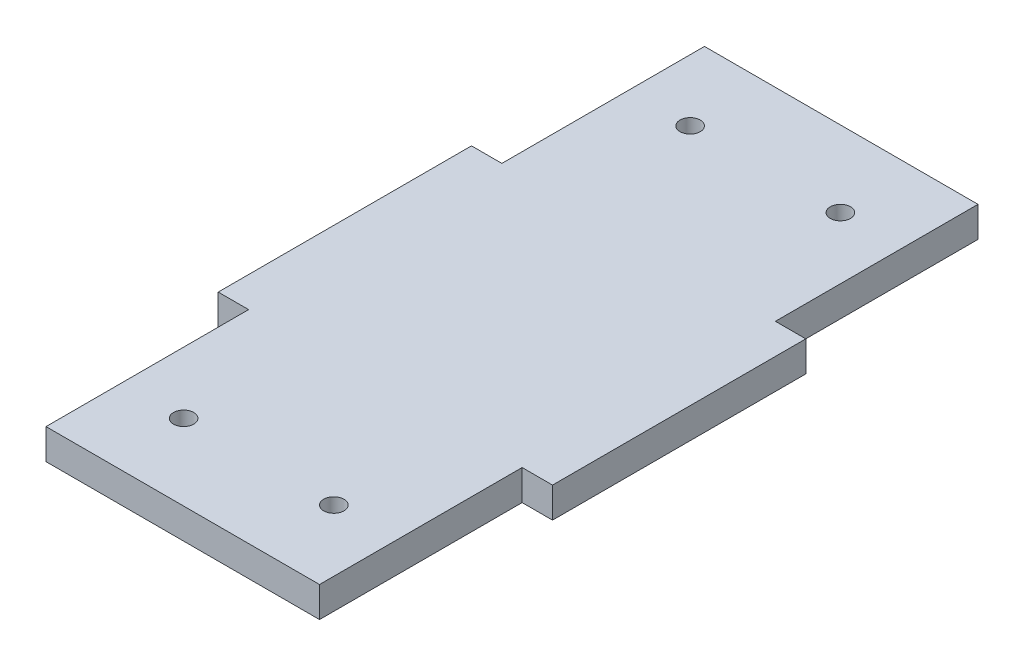
ISO-10303-21;
HEADER;
FILE_DESCRIPTION(('STEP AP214'),'2;1');
FILE_NAME('part.step','',(''),(''),'','','');
FILE_SCHEMA(('AUTOMOTIVE_DESIGN { 1 0 10303 214 1 1 1 1 }'));
ENDSEC;
DATA;
#1=APPLICATION_CONTEXT('core data for automotive mechanical design processes');
#2=APPLICATION_PROTOCOL_DEFINITION('international standard','automotive_design',2000,#1);
#3=PRODUCT_CONTEXT('',#1,'mechanical');
#4=PRODUCT('Part','Part','',(#3));
#5=PRODUCT_RELATED_PRODUCT_CATEGORY('part','',(#4));
#6=PRODUCT_DEFINITION_FORMATION('','',#4);
#7=PRODUCT_DEFINITION_CONTEXT('part definition',#1,'design');
#8=PRODUCT_DEFINITION('design','',#6,#7);
#9=PRODUCT_DEFINITION_SHAPE('','',#8);
#10=(LENGTH_UNIT() NAMED_UNIT(*) SI_UNIT(.MILLI.,.METRE.));
#11=(NAMED_UNIT(*) PLANE_ANGLE_UNIT() SI_UNIT($,.RADIAN.));
#12=(NAMED_UNIT(*) SI_UNIT($,.STERADIAN.) SOLID_ANGLE_UNIT());
#13=UNCERTAINTY_MEASURE_WITH_UNIT(LENGTH_MEASURE(1.E-05),#10,'distance_accuracy_value','');
#14=(GEOMETRIC_REPRESENTATION_CONTEXT(3) GLOBAL_UNCERTAINTY_ASSIGNED_CONTEXT((#13)) GLOBAL_UNIT_ASSIGNED_CONTEXT((#10,
#11,#12)) REPRESENTATION_CONTEXT('',''));
#15=CARTESIAN_POINT('',(0.,0.,0.));
#16=DIRECTION('',(0.,0.,1.));
#17=DIRECTION('',(1.,0.,0.));
#18=AXIS2_PLACEMENT_3D('',#15,#16,#17);
#19=CARTESIAN_POINT('',(0.,6.,31.206779661017));
#20=DIRECTION('',(0.,0.,-1.));
#21=DIRECTION('',(-1.,0.,0.));
#22=AXIS2_PLACEMENT_3D('',#19,#20,#21);
#23=PLANE('',#22);
#24=DIRECTION('',(1.,0.,0.));
#25=VECTOR('',#24,1.);
#26=CARTESIAN_POINT('',(0.,0.,31.206779661017));
#27=LINE('',#26,#25);
#28=CARTESIAN_POINT('',(-55.628420187569,0.,31.206779661017));
#29=VERTEX_POINT('',#28);
#30=CARTESIAN_POINT('',(-49.628420187569,0.,31.206779661017));
#31=VERTEX_POINT('',#30);
#32=EDGE_CURVE('E154',#29,#31,#27,.T.);
#33=ORIENTED_EDGE('',*,*,#32,.T.);
#34=DIRECTION('',(0.,-1.,0.));
#35=VECTOR('',#34,1.);
#36=CARTESIAN_POINT('',(-49.628420187569,6.,31.206779661017));
#37=LINE('',#36,#35);
#38=CARTESIAN_POINT('',(-49.628420187569,6.,31.206779661017));
#39=VERTEX_POINT('',#38);
#40=EDGE_CURVE('E11',#39,#31,#37,.T.);
#41=ORIENTED_EDGE('',*,*,#40,.F.);
#42=DIRECTION('',(1.,0.,0.));
#43=VECTOR('',#42,1.);
#44=CARTESIAN_POINT('',(0.,6.,31.206779661017));
#45=LINE('',#44,#43);
#46=CARTESIAN_POINT('',(-55.628420187569,6.,31.206779661017));
#47=VERTEX_POINT('',#46);
#48=EDGE_CURVE('E185',#47,#39,#45,.T.);
#49=ORIENTED_EDGE('',*,*,#48,.F.);
#50=DIRECTION('',(0.,-1.,0.));
#51=VECTOR('',#50,1.);
#52=CARTESIAN_POINT('',(-55.628420187569,6.,31.206779661017));
#53=LINE('',#52,#51);
#54=EDGE_CURVE('E150',#47,#29,#53,.T.);
#55=ORIENTED_EDGE('',*,*,#54,.T.);
#56=EDGE_LOOP('',(#33,#41,#49,#55));
#57=FACE_BOUND('',#56,.T.);
#58=ADVANCED_FACE('F35',(#57),#23,.F.);
#59=CARTESIAN_POINT('',(-49.628420187569,6.,0.));
#60=DIRECTION('',(1.,0.,0.));
#61=DIRECTION('',(0.,0.,-1.));
#62=AXIS2_PLACEMENT_3D('',#59,#60,#61);
#63=PLANE('',#62);
#64=DIRECTION('',(0.,0.,1.));
#65=VECTOR('',#64,1.);
#66=CARTESIAN_POINT('',(-49.628420187569,0.,0.));
#67=LINE('',#66,#65);
#68=CARTESIAN_POINT('',(-49.628420187569,0.,71.206779661017));
#69=VERTEX_POINT('',#68);
#70=EDGE_CURVE('E157',#31,#69,#67,.T.);
#71=ORIENTED_EDGE('',*,*,#70,.T.);
#72=DIRECTION('',(0.,-1.,0.));
#73=VECTOR('',#72,1.);
#74=CARTESIAN_POINT('',(-49.628420187569,6.,71.206779661017));
#75=LINE('',#74,#73);
#76=CARTESIAN_POINT('',(-49.628420187569,6.,71.206779661017));
#77=VERTEX_POINT('',#76);
#78=EDGE_CURVE('E43',#77,#69,#75,.T.);
#79=ORIENTED_EDGE('',*,*,#78,.F.);
#80=DIRECTION('',(0.,0.,1.));
#81=VECTOR('',#80,1.);
#82=CARTESIAN_POINT('',(-49.628420187569,6.,0.));
#83=LINE('',#82,#81);
#84=EDGE_CURVE('E102',#39,#77,#83,.T.);
#85=ORIENTED_EDGE('',*,*,#84,.F.);
#86=ORIENTED_EDGE('',*,*,#40,.T.);
#87=EDGE_LOOP('',(#71,#79,#85,#86));
#88=FACE_BOUND('',#87,.T.);
#89=ADVANCED_FACE('F251',(#88),#63,.F.);
#90=CARTESIAN_POINT('',(0.,6.,71.206779661017));
#91=DIRECTION('',(0.,0.,-1.));
#92=DIRECTION('',(-1.,0.,0.));
#93=AXIS2_PLACEMENT_3D('',#90,#91,#92);
#94=PLANE('',#93);
#95=DIRECTION('',(1.,0.,0.));
#96=VECTOR('',#95,1.);
#97=CARTESIAN_POINT('',(0.,0.,71.206779661017));
#98=LINE('',#97,#96);
#99=CARTESIAN_POINT('',(4.37157981243105,0.,71.206779661017));
#100=VERTEX_POINT('',#99);
#101=EDGE_CURVE('E160',#69,#100,#98,.T.);
#102=ORIENTED_EDGE('',*,*,#101,.T.);
#103=DIRECTION('',(0.,-1.,0.));
#104=VECTOR('',#103,1.);
#105=CARTESIAN_POINT('',(4.37157981243105,6.,71.206779661017));
#106=LINE('',#105,#104);
#107=CARTESIAN_POINT('',(4.37157981243105,6.,71.206779661017));
#108=VERTEX_POINT('',#107);
#109=EDGE_CURVE('E199',#108,#100,#106,.T.);
#110=ORIENTED_EDGE('',*,*,#109,.F.);
#111=DIRECTION('',(1.,0.,0.));
#112=VECTOR('',#111,1.);
#113=CARTESIAN_POINT('',(0.,6.,71.206779661017));
#114=LINE('',#113,#112);
#115=EDGE_CURVE('E206',#77,#108,#114,.T.);
#116=ORIENTED_EDGE('',*,*,#115,.F.);
#117=ORIENTED_EDGE('',*,*,#78,.T.);
#118=EDGE_LOOP('',(#102,#110,#116,#117));
#119=FACE_BOUND('',#118,.T.);
#120=ADVANCED_FACE('F204',(#119),#94,.F.);
#121=CARTESIAN_POINT('',(4.37157981243104,6.,0.));
#122=DIRECTION('',(1.,0.,0.));
#123=DIRECTION('',(0.,0.,-1.));
#124=AXIS2_PLACEMENT_3D('',#121,#122,#123);
#125=PLANE('',#124);
#126=DIRECTION('',(0.,0.,1.));
#127=VECTOR('',#126,1.);
#128=CARTESIAN_POINT('',(4.37157981243104,0.,0.));
#129=LINE('',#128,#127);
#130=CARTESIAN_POINT('',(4.37157981243105,0.,31.206779661017));
#131=VERTEX_POINT('',#130);
#132=EDGE_CURVE('E163',#131,#100,#129,.T.);
#133=ORIENTED_EDGE('',*,*,#132,.F.);
#134=DIRECTION('',(0.,-1.,0.));
#135=VECTOR('',#134,1.);
#136=CARTESIAN_POINT('',(4.37157981243105,6.,31.206779661017));
#137=LINE('',#136,#135);
#138=CARTESIAN_POINT('',(4.37157981243105,6.,31.206779661017));
#139=VERTEX_POINT('',#138);
#140=EDGE_CURVE('E197',#139,#131,#137,.T.);
#141=ORIENTED_EDGE('',*,*,#140,.F.);
#142=DIRECTION('',(0.,0.,1.));
#143=VECTOR('',#142,1.);
#144=CARTESIAN_POINT('',(4.37157981243104,6.,0.));
#145=LINE('',#144,#143);
#146=EDGE_CURVE('E217',#139,#108,#145,.T.);
#147=ORIENTED_EDGE('',*,*,#146,.T.);
#148=ORIENTED_EDGE('',*,*,#109,.T.);
#149=EDGE_LOOP('',(#133,#141,#147,#148));
#150=FACE_BOUND('',#149,.T.);
#151=ADVANCED_FACE('F213',(#150),#125,.T.);
#152=CARTESIAN_POINT('',(0.,6.,31.206779661017));
#153=DIRECTION('',(0.,0.,-1.));
#154=DIRECTION('',(-1.,0.,0.));
#155=AXIS2_PLACEMENT_3D('',#152,#153,#154);
#156=PLANE('',#155);
#157=DIRECTION('',(1.,0.,0.));
#158=VECTOR('',#157,1.);
#159=CARTESIAN_POINT('',(0.,0.,31.206779661017));
#160=LINE('',#159,#158);
#161=CARTESIAN_POINT('',(10.371579812431,0.,31.206779661017));
#162=VERTEX_POINT('',#161);
#163=EDGE_CURVE('E166',#131,#162,#160,.T.);
#164=ORIENTED_EDGE('',*,*,#163,.T.);
#165=DIRECTION('',(0.,-1.,0.));
#166=VECTOR('',#165,1.);
#167=CARTESIAN_POINT('',(10.371579812431,6.,31.206779661017));
#168=LINE('',#167,#166);
#169=CARTESIAN_POINT('',(10.371579812431,6.,31.206779661017));
#170=VERTEX_POINT('',#169);
#171=EDGE_CURVE('E195',#170,#162,#168,.T.);
#172=ORIENTED_EDGE('',*,*,#171,.F.);
#173=DIRECTION('',(1.,0.,0.));
#174=VECTOR('',#173,1.);
#175=CARTESIAN_POINT('',(0.,6.,31.206779661017));
#176=LINE('',#175,#174);
#177=EDGE_CURVE('E218',#139,#170,#176,.T.);
#178=ORIENTED_EDGE('',*,*,#177,.F.);
#179=ORIENTED_EDGE('',*,*,#140,.T.);
#180=EDGE_LOOP('',(#164,#172,#178,#179));
#181=FACE_BOUND('',#180,.T.);
#182=ADVANCED_FACE('F262',(#181),#156,.F.);
#183=CARTESIAN_POINT('',(10.371579812431,6.,0.));
#184=DIRECTION('',(1.,0.,0.));
#185=DIRECTION('',(0.,0.,-1.));
#186=AXIS2_PLACEMENT_3D('',#183,#184,#185);
#187=PLANE('',#186);
#188=DIRECTION('',(0.,0.,1.));
#189=VECTOR('',#188,1.);
#190=CARTESIAN_POINT('',(10.371579812431,0.,0.));
#191=LINE('',#190,#189);
#192=CARTESIAN_POINT('',(10.371579812431,0.,-18.793220338983));
#193=VERTEX_POINT('',#192);
#194=EDGE_CURVE('E169',#193,#162,#191,.T.);
#195=ORIENTED_EDGE('',*,*,#194,.F.);
#196=DIRECTION('',(0.,-1.,0.));
#197=VECTOR('',#196,1.);
#198=CARTESIAN_POINT('',(10.371579812431,6.,-18.793220338983));
#199=LINE('',#198,#197);
#200=CARTESIAN_POINT('',(10.371579812431,6.,-18.793220338983));
#201=VERTEX_POINT('',#200);
#202=EDGE_CURVE('E193',#201,#193,#199,.T.);
#203=ORIENTED_EDGE('',*,*,#202,.F.);
#204=DIRECTION('',(0.,0.,1.));
#205=VECTOR('',#204,1.);
#206=CARTESIAN_POINT('',(10.371579812431,6.,0.));
#207=LINE('',#206,#205);
#208=EDGE_CURVE('E220',#201,#170,#207,.T.);
#209=ORIENTED_EDGE('',*,*,#208,.T.);
#210=ORIENTED_EDGE('',*,*,#171,.T.);
#211=EDGE_LOOP('',(#195,#203,#209,#210));
#212=FACE_BOUND('',#211,.T.);
#213=ADVANCED_FACE('F265',(#212),#187,.T.);
#214=CARTESIAN_POINT('',(0.,6.,-18.793220338983));
#215=DIRECTION('',(0.,0.,-1.));
#216=DIRECTION('',(-1.,0.,0.));
#217=AXIS2_PLACEMENT_3D('',#214,#215,#216);
#218=PLANE('',#217);
#219=DIRECTION('',(1.,0.,0.));
#220=VECTOR('',#219,1.);
#221=CARTESIAN_POINT('',(0.,0.,-18.793220338983));
#222=LINE('',#221,#220);
#223=CARTESIAN_POINT('',(4.37157981243104,0.,-18.793220338983));
#224=VERTEX_POINT('',#223);
#225=EDGE_CURVE('E172',#224,#193,#222,.T.);
#226=ORIENTED_EDGE('',*,*,#225,.F.);
#227=DIRECTION('',(0.,-1.,0.));
#228=VECTOR('',#227,1.);
#229=CARTESIAN_POINT('',(4.37157981243104,6.,-18.793220338983));
#230=LINE('',#229,#228);
#231=CARTESIAN_POINT('',(4.37157981243104,6.,-18.793220338983));
#232=VERTEX_POINT('',#231);
#233=EDGE_CURVE('E191',#232,#224,#230,.T.);
#234=ORIENTED_EDGE('',*,*,#233,.F.);
#235=DIRECTION('',(1.,0.,0.));
#236=VECTOR('',#235,1.);
#237=CARTESIAN_POINT('',(0.,6.,-18.793220338983));
#238=LINE('',#237,#236);
#239=EDGE_CURVE('E227',#232,#201,#238,.T.);
#240=ORIENTED_EDGE('',*,*,#239,.T.);
#241=ORIENTED_EDGE('',*,*,#202,.T.);
#242=EDGE_LOOP('',(#226,#234,#240,#241));
#243=FACE_BOUND('',#242,.T.);
#244=ADVANCED_FACE('F269',(#243),#218,.T.);
#245=CARTESIAN_POINT('',(4.37157981243103,6.,0.));
#246=DIRECTION('',(1.,0.,0.));
#247=DIRECTION('',(0.,0.,-1.));
#248=AXIS2_PLACEMENT_3D('',#245,#246,#247);
#249=PLANE('',#248);
#250=DIRECTION('',(0.,0.,1.));
#251=VECTOR('',#250,1.);
#252=CARTESIAN_POINT('',(4.37157981243103,0.,0.));
#253=LINE('',#252,#251);
#254=CARTESIAN_POINT('',(4.37157981243105,0.,-58.793220338983));
#255=VERTEX_POINT('',#254);
#256=EDGE_CURVE('E175',#255,#224,#253,.T.);
#257=ORIENTED_EDGE('',*,*,#256,.F.);
#258=DIRECTION('',(0.,-1.,0.));
#259=VECTOR('',#258,1.);
#260=CARTESIAN_POINT('',(4.37157981243105,6.,-58.793220338983));
#261=LINE('',#260,#259);
#262=CARTESIAN_POINT('',(4.37157981243105,6.,-58.793220338983));
#263=VERTEX_POINT('',#262);
#264=EDGE_CURVE('E189',#263,#255,#261,.T.);
#265=ORIENTED_EDGE('',*,*,#264,.F.);
#266=DIRECTION('',(0.,0.,1.));
#267=VECTOR('',#266,1.);
#268=CARTESIAN_POINT('',(4.37157981243103,6.,0.));
#269=LINE('',#268,#267);
#270=EDGE_CURVE('E230',#263,#232,#269,.T.);
#271=ORIENTED_EDGE('',*,*,#270,.T.);
#272=ORIENTED_EDGE('',*,*,#233,.T.);
#273=EDGE_LOOP('',(#257,#265,#271,#272));
#274=FACE_BOUND('',#273,.T.);
#275=ADVANCED_FACE('F273',(#274),#249,.T.);
#276=CARTESIAN_POINT('',(0.,6.,-58.793220338983));
#277=DIRECTION('',(0.,0.,-1.));
#278=DIRECTION('',(-1.,0.,0.));
#279=AXIS2_PLACEMENT_3D('',#276,#277,#278);
#280=PLANE('',#279);
#281=DIRECTION('',(1.,0.,0.));
#282=VECTOR('',#281,1.);
#283=CARTESIAN_POINT('',(0.,0.,-58.793220338983));
#284=LINE('',#283,#282);
#285=CARTESIAN_POINT('',(-49.628420187569,0.,-58.793220338983));
#286=VERTEX_POINT('',#285);
#287=EDGE_CURVE('E178',#286,#255,#284,.T.);
#288=ORIENTED_EDGE('',*,*,#287,.F.);
#289=DIRECTION('',(0.,-1.,0.));
#290=VECTOR('',#289,1.);
#291=CARTESIAN_POINT('',(-49.628420187569,6.,-58.793220338983));
#292=LINE('',#291,#290);
#293=CARTESIAN_POINT('',(-49.628420187569,6.,-58.793220338983));
#294=VERTEX_POINT('',#293);
#295=EDGE_CURVE('E146',#294,#286,#292,.T.);
#296=ORIENTED_EDGE('',*,*,#295,.F.);
#297=DIRECTION('',(1.,0.,0.));
#298=VECTOR('',#297,1.);
#299=CARTESIAN_POINT('',(0.,6.,-58.793220338983));
#300=LINE('',#299,#298);
#301=EDGE_CURVE('E135',#294,#263,#300,.T.);
#302=ORIENTED_EDGE('',*,*,#301,.T.);
#303=ORIENTED_EDGE('',*,*,#264,.T.);
#304=EDGE_LOOP('',(#288,#296,#302,#303));
#305=FACE_BOUND('',#304,.T.);
#306=ADVANCED_FACE('F234',(#305),#280,.T.);
#307=CARTESIAN_POINT('',(-49.628420187569,6.,0.));
#308=DIRECTION('',(1.,0.,0.));
#309=DIRECTION('',(0.,0.,-1.));
#310=AXIS2_PLACEMENT_3D('',#307,#308,#309);
#311=PLANE('',#310);
#312=DIRECTION('',(0.,0.,1.));
#313=VECTOR('',#312,1.);
#314=CARTESIAN_POINT('',(-49.628420187569,0.,0.));
#315=LINE('',#314,#313);
#316=CARTESIAN_POINT('',(-49.628420187569,0.,-18.793220338983));
#317=VERTEX_POINT('',#316);
#318=EDGE_CURVE('E142',#286,#317,#315,.T.);
#319=ORIENTED_EDGE('',*,*,#318,.T.);
#320=DIRECTION('',(0.,-1.,0.));
#321=VECTOR('',#320,1.);
#322=CARTESIAN_POINT('',(-49.628420187569,6.,-18.793220338983));
#323=LINE('',#322,#321);
#324=CARTESIAN_POINT('',(-49.628420187569,6.,-18.793220338983));
#325=VERTEX_POINT('',#324);
#326=EDGE_CURVE('E139',#325,#317,#323,.T.);
#327=ORIENTED_EDGE('',*,*,#326,.F.);
#328=DIRECTION('',(0.,0.,1.));
#329=VECTOR('',#328,1.);
#330=CARTESIAN_POINT('',(-49.628420187569,6.,0.));
#331=LINE('',#330,#329);
#332=EDGE_CURVE('E128',#294,#325,#331,.T.);
#333=ORIENTED_EDGE('',*,*,#332,.F.);
#334=ORIENTED_EDGE('',*,*,#295,.T.);
#335=EDGE_LOOP('',(#319,#327,#333,#334));
#336=FACE_BOUND('',#335,.T.);
#337=ADVANCED_FACE('F140',(#336),#311,.F.);
#338=CARTESIAN_POINT('',(0.,6.,-18.793220338983));
#339=DIRECTION('',(0.,0.,-1.));
#340=DIRECTION('',(-1.,0.,0.));
#341=AXIS2_PLACEMENT_3D('',#338,#339,#340);
#342=PLANE('',#341);
#343=DIRECTION('',(1.,0.,0.));
#344=VECTOR('',#343,1.);
#345=CARTESIAN_POINT('',(0.,0.,-18.793220338983));
#346=LINE('',#345,#344);
#347=CARTESIAN_POINT('',(-55.628420187569,0.,-18.793220338983));
#348=VERTEX_POINT('',#347);
#349=EDGE_CURVE('E182',#348,#317,#346,.T.);
#350=ORIENTED_EDGE('',*,*,#349,.F.);
#351=DIRECTION('',(0.,-1.,0.));
#352=VECTOR('',#351,1.);
#353=CARTESIAN_POINT('',(-55.628420187569,6.,-18.793220338983));
#354=LINE('',#353,#352);
#355=CARTESIAN_POINT('',(-55.628420187569,6.,-18.793220338983));
#356=VERTEX_POINT('',#355);
#357=EDGE_CURVE('E91',#356,#348,#354,.T.);
#358=ORIENTED_EDGE('',*,*,#357,.F.);
#359=DIRECTION('',(1.,0.,0.));
#360=VECTOR('',#359,1.);
#361=CARTESIAN_POINT('',(0.,6.,-18.793220338983));
#362=LINE('',#361,#360);
#363=EDGE_CURVE('E132',#356,#325,#362,.T.);
#364=ORIENTED_EDGE('',*,*,#363,.T.);
#365=ORIENTED_EDGE('',*,*,#326,.T.);
#366=EDGE_LOOP('',(#350,#358,#364,#365));
#367=FACE_BOUND('',#366,.T.);
#368=ADVANCED_FACE('F148',(#367),#342,.T.);
#369=CARTESIAN_POINT('',(-55.628420187569,6.,0.));
#370=DIRECTION('',(1.,0.,0.));
#371=DIRECTION('',(0.,0.,-1.));
#372=AXIS2_PLACEMENT_3D('',#369,#370,#371);
#373=PLANE('',#372);
#374=DIRECTION('',(0.,0.,1.));
#375=VECTOR('',#374,1.);
#376=CARTESIAN_POINT('',(-55.628420187569,0.,0.));
#377=LINE('',#376,#375);
#378=EDGE_CURVE('E94',#348,#29,#377,.T.);
#379=ORIENTED_EDGE('',*,*,#378,.T.);
#380=ORIENTED_EDGE('',*,*,#54,.F.);
#381=DIRECTION('',(0.,0.,1.));
#382=VECTOR('',#381,1.);
#383=CARTESIAN_POINT('',(-55.628420187569,6.,0.));
#384=LINE('',#383,#382);
#385=EDGE_CURVE('E51',#356,#47,#384,.T.);
#386=ORIENTED_EDGE('',*,*,#385,.F.);
#387=ORIENTED_EDGE('',*,*,#357,.T.);
#388=EDGE_LOOP('',(#379,#380,#386,#387));
#389=FACE_BOUND('',#388,.T.);
#390=ADVANCED_FACE('F239',(#389),#373,.F.);
#391=CARTESIAN_POINT('',(0.,6.,0.));
#392=DIRECTION('',(0.,1.,0.));
#393=DIRECTION('',(0.,0.,1.));
#394=AXIS2_PLACEMENT_3D('',#391,#392,#393);
#395=PLANE('',#394);
#396=CARTESIAN_POINT('',(-37.458420187569,6.,56.206779661017));
#397=DIRECTION('',(0.,1.,0.));
#398=DIRECTION('',(0.,0.,1.));
#399=AXIS2_PLACEMENT_3D('',#396,#397,#398);
#400=CIRCLE('',#399,2.);
#401=CARTESIAN_POINT('',(-37.458420187569,6.,58.206779661017));
#402=VERTEX_POINT('',#401);
#403=EDGE_CURVE('E357',#402,#402,#400,.T.);
#404=ORIENTED_EDGE('',*,*,#403,.F.);
#405=EDGE_LOOP('',(#404));
#406=FACE_BOUND('',#405,.T.);
#407=CARTESIAN_POINT('',(-37.458420187569,6.,-43.793220338983));
#408=DIRECTION('',(0.,1.,0.));
#409=DIRECTION('',(0.,0.,1.));
#410=AXIS2_PLACEMENT_3D('',#407,#408,#409);
#411=CIRCLE('',#410,2.);
#412=CARTESIAN_POINT('',(-37.458420187569,6.,-41.793220338983));
#413=VERTEX_POINT('',#412);
#414=EDGE_CURVE('E359',#413,#413,#411,.T.);
#415=ORIENTED_EDGE('',*,*,#414,.F.);
#416=EDGE_LOOP('',(#415));
#417=FACE_BOUND('',#416,.T.);
#418=CARTESIAN_POINT('',(-7.79842018756895,6.,-43.793220338983));
#419=DIRECTION('',(0.,1.,0.));
#420=DIRECTION('',(0.,0.,1.));
#421=AXIS2_PLACEMENT_3D('',#418,#419,#420);
#422=CIRCLE('',#421,2.);
#423=CARTESIAN_POINT('',(-7.79842018756895,6.,-41.793220338983));
#424=VERTEX_POINT('',#423);
#425=EDGE_CURVE('E365',#424,#424,#422,.T.);
#426=ORIENTED_EDGE('',*,*,#425,.F.);
#427=EDGE_LOOP('',(#426));
#428=FACE_BOUND('',#427,.T.);
#429=CARTESIAN_POINT('',(-7.79842018756895,6.,56.206779661017));
#430=DIRECTION('',(0.,1.,0.));
#431=DIRECTION('',(0.,0.,1.));
#432=AXIS2_PLACEMENT_3D('',#429,#430,#431);
#433=CIRCLE('',#432,2.);
#434=CARTESIAN_POINT('',(-7.79842018756895,6.,58.206779661017));
#435=VERTEX_POINT('',#434);
#436=EDGE_CURVE('E371',#435,#435,#433,.T.);
#437=ORIENTED_EDGE('',*,*,#436,.F.);
#438=EDGE_LOOP('',(#437));
#439=FACE_BOUND('',#438,.T.);
#440=ORIENTED_EDGE('',*,*,#48,.T.);
#441=ORIENTED_EDGE('',*,*,#84,.T.);
#442=ORIENTED_EDGE('',*,*,#115,.T.);
#443=ORIENTED_EDGE('',*,*,#146,.F.);
#444=ORIENTED_EDGE('',*,*,#177,.T.);
#445=ORIENTED_EDGE('',*,*,#208,.F.);
#446=ORIENTED_EDGE('',*,*,#239,.F.);
#447=ORIENTED_EDGE('',*,*,#270,.F.);
#448=ORIENTED_EDGE('',*,*,#301,.F.);
#449=ORIENTED_EDGE('',*,*,#332,.T.);
#450=ORIENTED_EDGE('',*,*,#363,.F.);
#451=ORIENTED_EDGE('',*,*,#385,.T.);
#452=EDGE_LOOP('',(#440,#441,#442,#443,#444,#445,#446,#447,#448,#449,#450,#451));
#453=FACE_BOUND('',#452,.T.);
#454=ADVANCED_FACE('F130',(#406,#417,#428,#439,#453),#395,.T.);
#455=CARTESIAN_POINT('',(0.,0.,0.));
#456=DIRECTION('',(0.,1.,0.));
#457=DIRECTION('',(0.,0.,1.));
#458=AXIS2_PLACEMENT_3D('',#455,#456,#457);
#459=PLANE('',#458);
#460=CARTESIAN_POINT('',(-37.458420187569,0.,56.206779661017));
#461=DIRECTION('',(0.,1.,0.));
#462=DIRECTION('',(0.,0.,1.));
#463=AXIS2_PLACEMENT_3D('',#460,#461,#462);
#464=CIRCLE('',#463,2.);
#465=CARTESIAN_POINT('',(-37.458420187569,0.,58.206779661017));
#466=VERTEX_POINT('',#465);
#467=EDGE_CURVE('E354',#466,#466,#464,.T.);
#468=ORIENTED_EDGE('',*,*,#467,.T.);
#469=EDGE_LOOP('',(#468));
#470=FACE_BOUND('',#469,.T.);
#471=CARTESIAN_POINT('',(-37.458420187569,0.,-43.793220338983));
#472=DIRECTION('',(0.,1.,0.));
#473=DIRECTION('',(0.,0.,1.));
#474=AXIS2_PLACEMENT_3D('',#471,#472,#473);
#475=CIRCLE('',#474,2.);
#476=CARTESIAN_POINT('',(-37.458420187569,0.,-41.793220338983));
#477=VERTEX_POINT('',#476);
#478=EDGE_CURVE('E362',#477,#477,#475,.T.);
#479=ORIENTED_EDGE('',*,*,#478,.T.);
#480=EDGE_LOOP('',(#479));
#481=FACE_BOUND('',#480,.T.);
#482=CARTESIAN_POINT('',(-7.79842018756895,0.,-43.793220338983));
#483=DIRECTION('',(0.,1.,0.));
#484=DIRECTION('',(0.,0.,1.));
#485=AXIS2_PLACEMENT_3D('',#482,#483,#484);
#486=CIRCLE('',#485,2.);
#487=CARTESIAN_POINT('',(-7.79842018756895,0.,-41.793220338983));
#488=VERTEX_POINT('',#487);
#489=EDGE_CURVE('E368',#488,#488,#486,.T.);
#490=ORIENTED_EDGE('',*,*,#489,.T.);
#491=EDGE_LOOP('',(#490));
#492=FACE_BOUND('',#491,.T.);
#493=CARTESIAN_POINT('',(-7.79842018756895,0.,56.206779661017));
#494=DIRECTION('',(0.,1.,0.));
#495=DIRECTION('',(0.,0.,1.));
#496=AXIS2_PLACEMENT_3D('',#493,#494,#495);
#497=CIRCLE('',#496,2.);
#498=CARTESIAN_POINT('',(-7.79842018756895,0.,58.206779661017));
#499=VERTEX_POINT('',#498);
#500=EDGE_CURVE('E158',#499,#499,#497,.T.);
#501=ORIENTED_EDGE('',*,*,#500,.T.);
#502=EDGE_LOOP('',(#501));
#503=FACE_BOUND('',#502,.T.);
#504=ORIENTED_EDGE('',*,*,#32,.F.);
#505=ORIENTED_EDGE('',*,*,#378,.F.);
#506=ORIENTED_EDGE('',*,*,#349,.T.);
#507=ORIENTED_EDGE('',*,*,#318,.F.);
#508=ORIENTED_EDGE('',*,*,#287,.T.);
#509=ORIENTED_EDGE('',*,*,#256,.T.);
#510=ORIENTED_EDGE('',*,*,#225,.T.);
#511=ORIENTED_EDGE('',*,*,#194,.T.);
#512=ORIENTED_EDGE('',*,*,#163,.F.);
#513=ORIENTED_EDGE('',*,*,#132,.T.);
#514=ORIENTED_EDGE('',*,*,#101,.F.);
#515=ORIENTED_EDGE('',*,*,#70,.F.);
#516=EDGE_LOOP('',(#504,#505,#506,#507,#508,#509,#510,#511,#512,#513,#514,#515));
#517=FACE_BOUND('',#516,.T.);
#518=ADVANCED_FACE('F209',(#470,#481,#492,#503,#517),#459,.F.);
#519=CARTESIAN_POINT('',(-7.79842018756895,0.,56.206779661017));
#520=DIRECTION('',(0.,1.,0.));
#521=DIRECTION('',(0.,0.,1.));
#522=AXIS2_PLACEMENT_3D('',#519,#520,#521);
#523=CYLINDRICAL_SURFACE('',#522,2.);
#524=ORIENTED_EDGE('',*,*,#500,.F.);
#525=EDGE_LOOP('',(#524));
#526=FACE_BOUND('',#525,.T.);
#527=ORIENTED_EDGE('',*,*,#436,.T.);
#528=EDGE_LOOP('',(#527));
#529=FACE_BOUND('',#528,.T.);
#530=ADVANCED_FACE('F308',(#526,#529),#523,.F.);
#531=CARTESIAN_POINT('',(-7.79842018756895,0.,-43.793220338983));
#532=DIRECTION('',(0.,1.,0.));
#533=DIRECTION('',(0.,0.,1.));
#534=AXIS2_PLACEMENT_3D('',#531,#532,#533);
#535=CYLINDRICAL_SURFACE('',#534,2.);
#536=ORIENTED_EDGE('',*,*,#489,.F.);
#537=EDGE_LOOP('',(#536));
#538=FACE_BOUND('',#537,.T.);
#539=ORIENTED_EDGE('',*,*,#425,.T.);
#540=EDGE_LOOP('',(#539));
#541=FACE_BOUND('',#540,.T.);
#542=ADVANCED_FACE('F317',(#538,#541),#535,.F.);
#543=CARTESIAN_POINT('',(-37.458420187569,0.,-43.793220338983));
#544=DIRECTION('',(0.,1.,0.));
#545=DIRECTION('',(0.,0.,1.));
#546=AXIS2_PLACEMENT_3D('',#543,#544,#545);
#547=CYLINDRICAL_SURFACE('',#546,2.);
#548=ORIENTED_EDGE('',*,*,#478,.F.);
#549=EDGE_LOOP('',(#548));
#550=FACE_BOUND('',#549,.T.);
#551=ORIENTED_EDGE('',*,*,#414,.T.);
#552=EDGE_LOOP('',(#551));
#553=FACE_BOUND('',#552,.T.);
#554=ADVANCED_FACE('F327',(#550,#553),#547,.F.);
#555=CARTESIAN_POINT('',(-37.458420187569,0.,56.206779661017));
#556=DIRECTION('',(0.,1.,0.));
#557=DIRECTION('',(0.,0.,1.));
#558=AXIS2_PLACEMENT_3D('',#555,#556,#557);
#559=CYLINDRICAL_SURFACE('',#558,2.);
#560=ORIENTED_EDGE('',*,*,#467,.F.);
#561=EDGE_LOOP('',(#560));
#562=FACE_BOUND('',#561,.T.);
#563=ORIENTED_EDGE('',*,*,#403,.T.);
#564=EDGE_LOOP('',(#563));
#565=FACE_BOUND('',#564,.T.);
#566=ADVANCED_FACE('F337',(#562,#565),#559,.F.);
#567=CLOSED_SHELL('',(#58,#89,#120,#151,#182,#213,#244,#275,#306,#337,#368,#390,#454,#518,#530,
#542,#554,#566));
#568=MANIFOLD_SOLID_BREP('B2',#567);
#569=ADVANCED_BREP_SHAPE_REPRESENTATION('',(#18,#568),#14);
#570=SHAPE_DEFINITION_REPRESENTATION(#9,#569);
ENDSEC;
END-ISO-10303-21;
